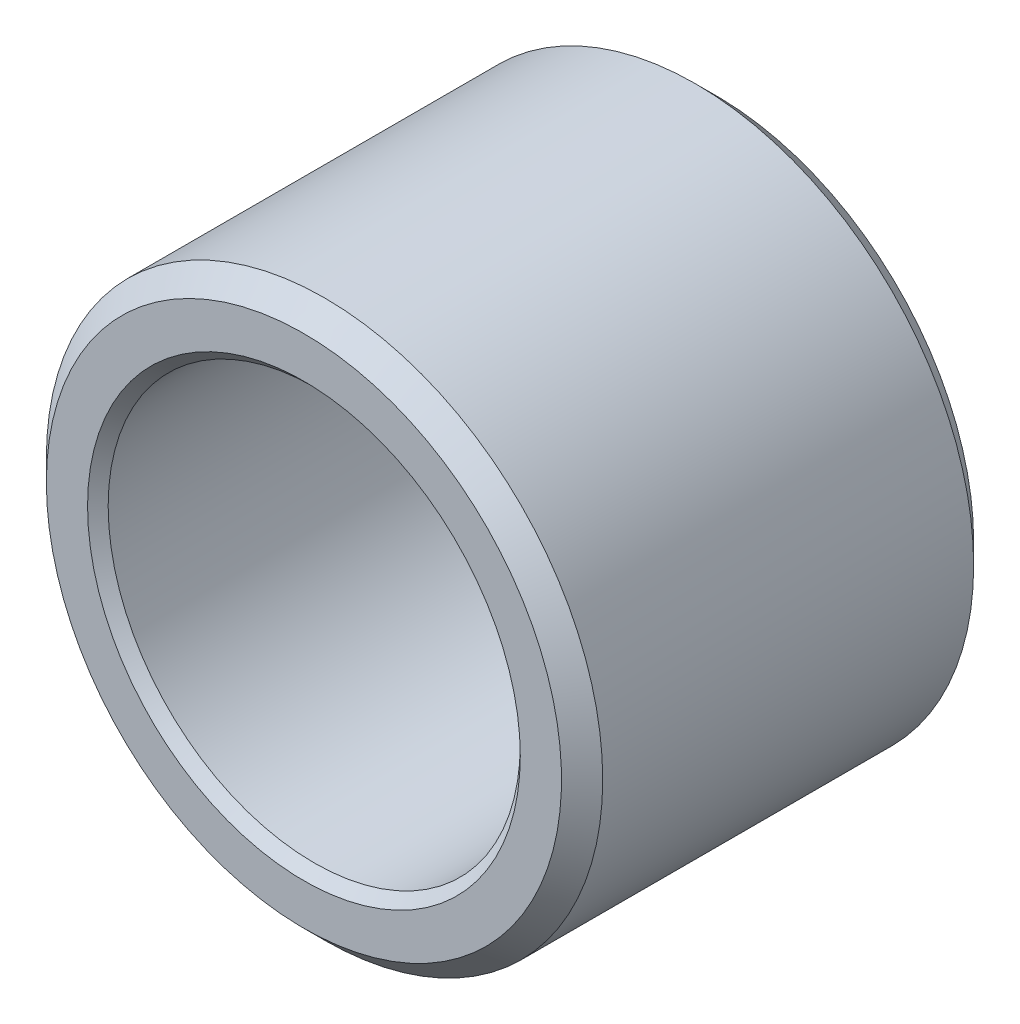
ISO-10303-21;
HEADER;
FILE_DESCRIPTION(('STEP AP214'),'2;1');
FILE_NAME('part.step','',(''),(''),'','','');
FILE_SCHEMA(('AUTOMOTIVE_DESIGN { 1 0 10303 214 1 1 1 1 }'));
ENDSEC;
DATA;
#1=APPLICATION_CONTEXT('core data for automotive mechanical design processes');
#2=APPLICATION_PROTOCOL_DEFINITION('international standard','automotive_design',2000,#1);
#3=PRODUCT_CONTEXT('',#1,'mechanical');
#4=PRODUCT('Part','Part','',(#3));
#5=PRODUCT_RELATED_PRODUCT_CATEGORY('part','',(#4));
#6=PRODUCT_DEFINITION_FORMATION('','',#4);
#7=PRODUCT_DEFINITION_CONTEXT('part definition',#1,'design');
#8=PRODUCT_DEFINITION('design','',#6,#7);
#9=PRODUCT_DEFINITION_SHAPE('','',#8);
#10=(LENGTH_UNIT() NAMED_UNIT(*) SI_UNIT(.MILLI.,.METRE.));
#11=(NAMED_UNIT(*) PLANE_ANGLE_UNIT() SI_UNIT($,.RADIAN.));
#12=(NAMED_UNIT(*) SI_UNIT($,.STERADIAN.) SOLID_ANGLE_UNIT());
#13=UNCERTAINTY_MEASURE_WITH_UNIT(LENGTH_MEASURE(1.E-05),#10,'distance_accuracy_value','');
#14=(GEOMETRIC_REPRESENTATION_CONTEXT(3) GLOBAL_UNCERTAINTY_ASSIGNED_CONTEXT((#13)) GLOBAL_UNIT_ASSIGNED_CONTEXT((#10,
#11,#12)) REPRESENTATION_CONTEXT('',''));
#15=CARTESIAN_POINT('',(0.,0.,0.));
#16=DIRECTION('',(0.,0.,1.));
#17=DIRECTION('',(1.,0.,0.));
#18=AXIS2_PLACEMENT_3D('',#15,#16,#17);
#19=CARTESIAN_POINT('',(0.,-2.77555756156289E-13,20.));
#20=DIRECTION('',(0.,0.,1.));
#21=DIRECTION('',(1.,0.,0.));
#22=AXIS2_PLACEMENT_3D('',#19,#20,#21);
#23=PLANE('',#22);
#24=CARTESIAN_POINT('',(0.,-2.77555756156289E-13,20.));
#25=DIRECTION('',(0.,0.,1.));
#26=DIRECTION('',(1.,0.,0.));
#27=AXIS2_PLACEMENT_3D('',#24,#25,#26);
#28=CIRCLE('',#27,10.5);
#29=CARTESIAN_POINT('',(10.5,-2.77555756156289E-13,20.));
#30=VERTEX_POINT('',#29);
#31=EDGE_CURVE('E12',#30,#30,#28,.F.);
#32=ORIENTED_EDGE('',*,*,#31,.T.);
#33=EDGE_LOOP('',(#32));
#34=FACE_BOUND('',#33,.T.);
#35=CARTESIAN_POINT('',(0.,-2.77555756156289E-13,20.));
#36=DIRECTION('',(0.,0.,1.));
#37=DIRECTION('',(1.,0.,0.));
#38=AXIS2_PLACEMENT_3D('',#35,#36,#37);
#39=CIRCLE('',#38,12.5);
#40=CARTESIAN_POINT('',(-12.5,-2.77555756156289E-13,20.));
#41=VERTEX_POINT('',#40);
#42=EDGE_CURVE('E78',#41,#41,#39,.T.);
#43=ORIENTED_EDGE('',*,*,#42,.T.);
#44=EDGE_LOOP('',(#43));
#45=FACE_BOUND('',#44,.T.);
#46=ADVANCED_FACE('F49',(#34,#45),#23,.T.);
#47=CARTESIAN_POINT('',(0.,0.,0.));
#48=DIRECTION('',(0.,0.,1.));
#49=DIRECTION('',(1.,0.,0.));
#50=AXIS2_PLACEMENT_3D('',#47,#48,#49);
#51=PLANE('',#50);
#52=CARTESIAN_POINT('',(0.,0.,0.));
#53=DIRECTION('',(0.,0.,1.));
#54=DIRECTION('',(1.,0.,0.));
#55=AXIS2_PLACEMENT_3D('',#52,#53,#54);
#56=CIRCLE('',#55,10.5);
#57=CARTESIAN_POINT('',(-10.5,0.,0.));
#58=VERTEX_POINT('',#57);
#59=EDGE_CURVE('E64',#58,#58,#56,.T.);
#60=ORIENTED_EDGE('',*,*,#59,.T.);
#61=EDGE_LOOP('',(#60));
#62=FACE_BOUND('',#61,.T.);
#63=CARTESIAN_POINT('',(0.,0.,0.));
#64=DIRECTION('',(0.,0.,1.));
#65=DIRECTION('',(1.,0.,0.));
#66=AXIS2_PLACEMENT_3D('',#63,#64,#65);
#67=CIRCLE('',#66,12.5);
#68=CARTESIAN_POINT('',(12.5,0.,0.));
#69=VERTEX_POINT('',#68);
#70=EDGE_CURVE('E69',#69,#69,#67,.F.);
#71=ORIENTED_EDGE('',*,*,#70,.T.);
#72=EDGE_LOOP('',(#71));
#73=FACE_BOUND('',#72,.T.);
#74=ADVANCED_FACE('F101',(#62,#73),#51,.F.);
#75=CARTESIAN_POINT('',(0.,-2.77555756156289E-13,20.));
#76=DIRECTION('',(0.,0.,-1.));
#77=DIRECTION('',(-1.,0.,0.));
#78=AXIS2_PLACEMENT_3D('',#75,#76,#77);
#79=CYLINDRICAL_SURFACE('',#78,13.5);
#80=CARTESIAN_POINT('',(1.11022302462516E-13,-1.66533453693773E-13,19.));
#81=DIRECTION('',(0.,0.,1.));
#82=DIRECTION('',(1.,0.,0.));
#83=AXIS2_PLACEMENT_3D('',#80,#81,#82);
#84=CIRCLE('',#83,13.5);
#85=CARTESIAN_POINT('',(-13.5,-2.77583511731905E-13,19.));
#86=VERTEX_POINT('',#85);
#87=EDGE_CURVE('E72',#86,#86,#84,.F.);
#88=CARTESIAN_POINT('',(0.,-1.66533453693773E-13,1.00000000000011));
#89=DIRECTION('',(0.,0.,1.));
#90=DIRECTION('',(1.,0.,0.));
#91=AXIS2_PLACEMENT_3D('',#88,#89,#90);
#92=CIRCLE('',#91,13.5);
#93=CARTESIAN_POINT('',(-13.5,-2.78083112092986E-13,1.00000000000011));
#94=VERTEX_POINT('',#93);
#95=EDGE_CURVE('E75',#94,#94,#92,.T.);
#96=CARTESIAN_POINT('',(-13.5,-2.77583511731905E-13,19.));
#97=CARTESIAN_POINT('',(-13.5,-2.77588715902333E-13,18.8125));
#98=CARTESIAN_POINT('',(-13.5,-2.77593920072761E-13,18.625));
#99=CARTESIAN_POINT('',(-13.5,-2.77604328413616E-13,18.25));
#100=CARTESIAN_POINT('',(-13.5,-2.77609532584044E-13,18.0625));
#101=CARTESIAN_POINT('',(-13.5,-2.776199409249E-13,17.6875));
#102=CARTESIAN_POINT('',(-13.5,-2.77625145095328E-13,17.5));
#103=CARTESIAN_POINT('',(-13.5,-2.77635553436184E-13,17.125));
#104=CARTESIAN_POINT('',(-13.5,-2.77640757606612E-13,16.9375));
#105=CARTESIAN_POINT('',(-13.5,-2.77651165947468E-13,16.5625));
#106=CARTESIAN_POINT('',(-13.5,-2.77656370117896E-13,16.375));
#107=CARTESIAN_POINT('',(-13.5,-2.77666778458752E-13,16.));
#108=CARTESIAN_POINT('',(-13.5,-2.7767198262918E-13,15.8125));
#109=CARTESIAN_POINT('',(-13.5,-2.77682390970035E-13,15.4375));
#110=CARTESIAN_POINT('',(-13.5,-2.77687595140463E-13,15.25));
#111=CARTESIAN_POINT('',(-13.5,-2.77698003481319E-13,14.875));
#112=CARTESIAN_POINT('',(-13.5,-2.77703207651747E-13,14.6875));
#113=CARTESIAN_POINT('',(-13.5,-2.77713615992603E-13,14.3125));
#114=CARTESIAN_POINT('',(-13.5,-2.77718820163031E-13,14.125));
#115=CARTESIAN_POINT('',(-13.5,-2.77729228503887E-13,13.75));
#116=CARTESIAN_POINT('',(-13.5,-2.77734432674315E-13,13.5625));
#117=CARTESIAN_POINT('',(-13.5,-2.77744841015171E-13,13.1875));
#118=CARTESIAN_POINT('',(-13.5,-2.77750045185599E-13,13.));
#119=CARTESIAN_POINT('',(-13.5,-2.77760453526454E-13,12.6250000000001));
#120=CARTESIAN_POINT('',(-13.5,-2.77765657696882E-13,12.4375000000001));
#121=CARTESIAN_POINT('',(-13.5,-2.77776066037738E-13,12.0625000000001));
#122=CARTESIAN_POINT('',(-13.5,-2.77781270208166E-13,11.8750000000001));
#123=CARTESIAN_POINT('',(-13.5,-2.77791678549022E-13,11.5000000000001));
#124=CARTESIAN_POINT('',(-13.5,-2.7779688271945E-13,11.3125000000001));
#125=CARTESIAN_POINT('',(-13.5,-2.77807291060306E-13,10.9375000000001));
#126=CARTESIAN_POINT('',(-13.5,-2.77812495230734E-13,10.7500000000001));
#127=CARTESIAN_POINT('',(-13.5,-2.7782290357159E-13,10.3750000000001));
#128=CARTESIAN_POINT('',(-13.5,-2.77828107742017E-13,10.1875000000001));
#129=CARTESIAN_POINT('',(-13.5,-2.77838516082873E-13,9.81250000000007));
#130=CARTESIAN_POINT('',(-13.5,-2.77843720253301E-13,9.62500000000007));
#131=CARTESIAN_POINT('',(-13.5,-2.77854128594157E-13,9.25000000000007));
#132=CARTESIAN_POINT('',(-13.5,-2.77859332764585E-13,9.06250000000007));
#133=CARTESIAN_POINT('',(-13.5,-2.77869741105441E-13,8.68750000000007));
#134=CARTESIAN_POINT('',(-13.5,-2.77874945275869E-13,8.50000000000007));
#135=CARTESIAN_POINT('',(-13.5,-2.77885353616725E-13,8.12500000000008));
#136=CARTESIAN_POINT('',(-13.5,-2.77890557787153E-13,7.93750000000008));
#137=CARTESIAN_POINT('',(-13.5,-2.77900966128008E-13,7.56250000000008));
#138=CARTESIAN_POINT('',(-13.5,-2.77906170298436E-13,7.37500000000008));
#139=CARTESIAN_POINT('',(-13.5,-2.77916578639292E-13,7.00000000000008));
#140=CARTESIAN_POINT('',(-13.5,-2.7792178280972E-13,6.81250000000008));
#141=CARTESIAN_POINT('',(-13.5,-2.77932191150576E-13,6.43750000000009));
#142=CARTESIAN_POINT('',(-13.5,-2.77937395321004E-13,6.25000000000009));
#143=CARTESIAN_POINT('',(-13.5,-2.7794780366186E-13,5.87500000000009));
#144=CARTESIAN_POINT('',(-13.5,-2.77953007832288E-13,5.68750000000009));
#145=CARTESIAN_POINT('',(-13.5,-2.77963416173144E-13,5.31250000000009));
#146=CARTESIAN_POINT('',(-13.5,-2.77968620343572E-13,5.12500000000009));
#147=CARTESIAN_POINT('',(-13.5,-2.77979028684427E-13,4.75000000000009));
#148=CARTESIAN_POINT('',(-13.5,-2.77984232854855E-13,4.5625000000001));
#149=CARTESIAN_POINT('',(-13.5,-2.77994641195711E-13,4.1875000000001));
#150=CARTESIAN_POINT('',(-13.5,-2.77999845366139E-13,4.0000000000001));
#151=CARTESIAN_POINT('',(-13.5,-2.78010253706995E-13,3.6250000000001));
#152=CARTESIAN_POINT('',(-13.5,-2.78015457877423E-13,3.4375000000001));
#153=CARTESIAN_POINT('',(-13.5,-2.78025866218279E-13,3.0625000000001));
#154=CARTESIAN_POINT('',(-13.5,-2.78031070388707E-13,2.8750000000001));
#155=CARTESIAN_POINT('',(-13.5,-2.78041478729563E-13,2.5000000000001));
#156=CARTESIAN_POINT('',(-13.5,-2.78046682899991E-13,2.3125000000001));
#157=CARTESIAN_POINT('',(-13.5,-2.78057091240846E-13,1.93750000000011));
#158=CARTESIAN_POINT('',(-13.5,-2.78062295411274E-13,1.75000000000011));
#159=CARTESIAN_POINT('',(-13.5,-2.7807270375213E-13,1.37500000000011));
#160=CARTESIAN_POINT('',(-13.5,-2.78077907922558E-13,1.18750000000011));
#161=CARTESIAN_POINT('',(-13.5,-2.78083112092986E-13,1.00000000000011));
#162=B_SPLINE_CURVE_WITH_KNOTS('',3,(#96,#97,#98,#99,#100,#101,#102,#103,#104,#105,#106,#107,
#108,#109,#110,#111,#112,#113,#114,#115,#116,#117,#118,#119,#120,#121,#122,#123,#124,#125,#126,
#127,#128,#129,#130,#131,#132,#133,#134,#135,#136,#137,#138,#139,#140,#141,#142,#143,#144,#145,
#146,#147,#148,#149,#150,#151,#152,#153,#154,#155,#156,#157,#158,#159,#160,#161),.UNSPECIFIED.,
.F.,.F.,(4,2,2,2,2,2,2,2,2,2,2,2,2,2,2,2,2,2,2,2,2,2,2,2,2,2,2,2,2,2,2,2,4),(0.,
0.562499999999997,1.12499999999999,1.68749999999999,2.24999999999999,2.81249999999999,
3.37499999999998,3.93749999999998,4.49999999999998,5.06249999999997,5.62499999999997,
6.18749999999997,6.74999999999996,7.31249999999996,7.87499999999996,8.43749999999996,
8.99999999999995,9.56249999999995,10.1249999999999,10.6874999999999,11.2499999999999,
11.8124999999999,12.3749999999999,12.9374999999999,13.4999999999999,14.0624999999999,
14.6249999999999,15.1874999999999,15.7499999999999,16.3124999999999,16.8749999999999,
17.4374999999999,17.9999999999999),.UNSPECIFIED.);
#163=EDGE_CURVE('BSEAM96',#86,#94,#162,.T.);
#164=ORIENTED_EDGE('',*,*,#87,.T.);
#165=ORIENTED_EDGE('',*,*,#95,.T.);
#166=ORIENTED_EDGE('',*,*,#163,.T.);
#167=ORIENTED_EDGE('',*,*,#163,.F.);
#168=EDGE_LOOP('',(#164,#166,#165,#167));
#169=FACE_BOUND('',#168,.T.);
#170=ADVANCED_FACE('F96',(#169),#79,.T.);
#171=CARTESIAN_POINT('',(0.,-2.77555756156289E-13,20.));
#172=DIRECTION('',(0.,0.,-1.));
#173=DIRECTION('',(-1.,0.,0.));
#174=AXIS2_PLACEMENT_3D('',#171,#172,#173);
#175=CYLINDRICAL_SURFACE('',#174,10.);
#176=CARTESIAN_POINT('',(0.,0.,0.500000000000056));
#177=DIRECTION('',(0.,0.,1.));
#178=DIRECTION('',(1.,0.,0.));
#179=AXIS2_PLACEMENT_3D('',#176,#177,#178);
#180=CIRCLE('',#179,10.);
#181=CARTESIAN_POINT('',(-10.,-2.78096989880794E-13,0.500000000000056));
#182=VERTEX_POINT('',#181);
#183=EDGE_CURVE('E56',#182,#182,#180,.F.);
#184=CARTESIAN_POINT('',(0.,-1.66533453693773E-13,19.5000000000001));
#185=DIRECTION('',(0.,0.,1.));
#186=DIRECTION('',(1.,0.,0.));
#187=AXIS2_PLACEMENT_3D('',#184,#185,#186);
#188=CIRCLE('',#187,10.);
#189=CARTESIAN_POINT('',(-10.,-2.77569633944097E-13,19.5000000000001));
#190=VERTEX_POINT('',#189);
#191=EDGE_CURVE('E60',#190,#190,#188,.T.);
#192=CARTESIAN_POINT('',(-10.,-2.78096989880794E-13,0.500000000000056));
#193=CARTESIAN_POINT('',(-10.,-2.78091496589787E-13,0.697916666666723));
#194=CARTESIAN_POINT('',(-10.,-2.78086003298779E-13,0.89583333333339));
#195=CARTESIAN_POINT('',(-10.,-2.78075016716765E-13,1.29166666666672));
#196=CARTESIAN_POINT('',(-10.,-2.78069523425758E-13,1.48958333333339));
#197=CARTESIAN_POINT('',(-10.,-2.78058536843743E-13,1.88541666666672));
#198=CARTESIAN_POINT('',(-10.,-2.78053043552736E-13,2.08333333333339));
#199=CARTESIAN_POINT('',(-10.,-2.78042056970721E-13,2.47916666666672));
#200=CARTESIAN_POINT('',(-10.,-2.78036563679714E-13,2.67708333333339));
#201=CARTESIAN_POINT('',(-10.,-2.780255770977E-13,3.07291666666673));
#202=CARTESIAN_POINT('',(-10.,-2.78020083806692E-13,3.27083333333339));
#203=CARTESIAN_POINT('',(-10.,-2.78009097224678E-13,3.66666666666673));
#204=CARTESIAN_POINT('',(-10.,-2.7800360393367E-13,3.86458333333339));
#205=CARTESIAN_POINT('',(-10.,-2.77992617351656E-13,4.26041666666673));
#206=CARTESIAN_POINT('',(-10.,-2.77987124060649E-13,4.45833333333339));
#207=CARTESIAN_POINT('',(-10.,-2.77976137478634E-13,4.85416666666673));
#208=CARTESIAN_POINT('',(-10.,-2.77970644187627E-13,5.05208333333339));
#209=CARTESIAN_POINT('',(-10.,-2.77959657605612E-13,5.44791666666673));
#210=CARTESIAN_POINT('',(-10.,-2.77954164314605E-13,5.64583333333339));
#211=CARTESIAN_POINT('',(-10.,-2.77943177732591E-13,6.04166666666673));
#212=CARTESIAN_POINT('',(-10.,-2.77937684441583E-13,6.23958333333339));
#213=CARTESIAN_POINT('',(-10.,-2.77926697859569E-13,6.63541666666673));
#214=CARTESIAN_POINT('',(-10.,-2.77921204568562E-13,6.83333333333339));
#215=CARTESIAN_POINT('',(-10.,-2.77910217986547E-13,7.22916666666673));
#216=CARTESIAN_POINT('',(-10.,-2.7790472469554E-13,7.4270833333334));
#217=CARTESIAN_POINT('',(-10.,-2.77893738113525E-13,7.82291666666673));
#218=CARTESIAN_POINT('',(-10.,-2.77888244822518E-13,8.0208333333334));
#219=CARTESIAN_POINT('',(-10.,-2.77877258240504E-13,8.41666666666673));
#220=CARTESIAN_POINT('',(-10.,-2.77871764949496E-13,8.6145833333334));
#221=CARTESIAN_POINT('',(-10.,-2.77860778367482E-13,9.01041666666673));
#222=CARTESIAN_POINT('',(-10.,-2.77855285076474E-13,9.2083333333334));
#223=CARTESIAN_POINT('',(-10.,-2.7784429849446E-13,9.60416666666673));
#224=CARTESIAN_POINT('',(-10.,-2.77838805203453E-13,9.8020833333334));
#225=CARTESIAN_POINT('',(-10.,-2.77827818621438E-13,10.1979166666667));
#226=CARTESIAN_POINT('',(-10.,-2.77822325330431E-13,10.3958333333334));
#227=CARTESIAN_POINT('',(-10.,-2.77811338748416E-13,10.7916666666667));
#228=CARTESIAN_POINT('',(-10.,-2.77805845457409E-13,10.9895833333334));
#229=CARTESIAN_POINT('',(-10.,-2.77794858875395E-13,11.3854166666667));
#230=CARTESIAN_POINT('',(-10.,-2.77789365584387E-13,11.5833333333334));
#231=CARTESIAN_POINT('',(-10.,-2.77778379002373E-13,11.9791666666667));
#232=CARTESIAN_POINT('',(-10.,-2.77772885711366E-13,12.1770833333334));
#233=CARTESIAN_POINT('',(-10.,-2.77761899129351E-13,12.5729166666667));
#234=CARTESIAN_POINT('',(-10.,-2.77756405838344E-13,12.7708333333334));
#235=CARTESIAN_POINT('',(-10.,-2.77745419256329E-13,13.1666666666667));
#236=CARTESIAN_POINT('',(-10.,-2.77739925965322E-13,13.3645833333334));
#237=CARTESIAN_POINT('',(-10.,-2.77728939383308E-13,13.7604166666667));
#238=CARTESIAN_POINT('',(-10.,-2.777234460923E-13,13.9583333333334));
#239=CARTESIAN_POINT('',(-10.,-2.77712459510286E-13,14.3541666666667));
#240=CARTESIAN_POINT('',(-10.,-2.77706966219278E-13,14.5520833333334));
#241=CARTESIAN_POINT('',(-10.,-2.77695979637264E-13,14.9479166666667));
#242=CARTESIAN_POINT('',(-10.,-2.77690486346257E-13,15.1458333333334));
#243=CARTESIAN_POINT('',(-10.,-2.77679499764242E-13,15.5416666666667));
#244=CARTESIAN_POINT('',(-10.,-2.77674006473235E-13,15.7395833333334));
#245=CARTESIAN_POINT('',(-10.,-2.7766301989122E-13,16.1354166666667));
#246=CARTESIAN_POINT('',(-10.,-2.77657526600213E-13,16.3333333333334));
#247=CARTESIAN_POINT('',(-10.,-2.77646540018199E-13,16.7291666666667));
#248=CARTESIAN_POINT('',(-10.,-2.77641046727191E-13,16.9270833333334));
#249=CARTESIAN_POINT('',(-10.,-2.77630060145177E-13,17.3229166666667));
#250=CARTESIAN_POINT('',(-10.,-2.7762456685417E-13,17.5208333333334));
#251=CARTESIAN_POINT('',(-10.,-2.77613580272155E-13,17.9166666666667));
#252=CARTESIAN_POINT('',(-10.,-2.77608086981148E-13,18.1145833333334));
#253=CARTESIAN_POINT('',(-10.,-2.77597100399133E-13,18.5104166666667));
#254=CARTESIAN_POINT('',(-10.,-2.77591607108126E-13,18.7083333333334));
#255=CARTESIAN_POINT('',(-10.,-2.77580620526111E-13,19.1041666666667));
#256=CARTESIAN_POINT('',(-10.,-2.77575127235104E-13,19.3020833333334));
#257=CARTESIAN_POINT('',(-10.,-2.77569633944097E-13,19.5000000000001));
#258=B_SPLINE_CURVE_WITH_KNOTS('',3,(#192,#193,#194,#195,#196,#197,#198,#199,#200,#201,#202,
#203,#204,#205,#206,#207,#208,#209,#210,#211,#212,#213,#214,#215,#216,#217,#218,#219,#220,#221,
#222,#223,#224,#225,#226,#227,#228,#229,#230,#231,#232,#233,#234,#235,#236,#237,#238,#239,#240,
#241,#242,#243,#244,#245,#246,#247,#248,#249,#250,#251,#252,#253,#254,#255,#256,#257),
.UNSPECIFIED.,.F.,.F.,(4,2,2,2,2,2,2,2,2,2,2,2,2,2,2,2,2,2,2,2,2,2,2,2,2,2,2,2,2,2,2,2,4),(0.,
0.593750000000001,1.1875,1.78125,2.375,2.96875,3.5625,4.15625,4.75,5.34375,5.9375,6.53125,
7.12500000000001,7.71875000000001,8.31250000000001,8.90625000000001,9.50000000000001,10.09375,
10.6875,11.28125,11.875,12.46875,13.0625,13.65625,14.25,14.84375,15.4375,16.03125,16.625,
17.21875,17.8125,18.40625,19.),.UNSPECIFIED.);
#259=EDGE_CURVE('BSEAM86',#182,#190,#258,.T.);
#260=ORIENTED_EDGE('',*,*,#183,.T.);
#261=ORIENTED_EDGE('',*,*,#191,.T.);
#262=ORIENTED_EDGE('',*,*,#259,.T.);
#263=ORIENTED_EDGE('',*,*,#259,.F.);
#264=EDGE_LOOP('',(#260,#262,#261,#263));
#265=FACE_BOUND('',#264,.T.);
#266=ADVANCED_FACE('F86',(#265),#175,.F.);
#267=CARTESIAN_POINT('',(0.,-2.77555756156289E-13,20.));
#268=DIRECTION('',(0.,0.,-1.));
#269=DIRECTION('',(-1.,0.,0.));
#270=AXIS2_PLACEMENT_3D('',#267,#268,#269);
#271=CONICAL_SURFACE('',#270,12.5,0.785398163397448);
#272=CARTESIAN_POINT('',(-13.5,-2.77583511731905E-13,19.));
#273=CARTESIAN_POINT('',(-13.4895833333333,-2.77583222611325E-13,19.0104166666667));
#274=CARTESIAN_POINT('',(-13.4791666666667,-2.77582933490746E-13,19.0208333333333));
#275=CARTESIAN_POINT('',(-13.4583333333333,-2.77582355249587E-13,19.0416666666667));
#276=CARTESIAN_POINT('',(-13.4479166666667,-2.77582066129008E-13,19.0520833333333));
#277=CARTESIAN_POINT('',(-13.4270833333333,-2.77581487887849E-13,19.0729166666667));
#278=CARTESIAN_POINT('',(-13.4166666666667,-2.7758119876727E-13,19.0833333333333));
#279=CARTESIAN_POINT('',(-13.3958333333333,-2.77580620526111E-13,19.1041666666667));
#280=CARTESIAN_POINT('',(-13.3854166666667,-2.77580331405532E-13,19.1145833333333));
#281=CARTESIAN_POINT('',(-13.3645833333333,-2.77579753164373E-13,19.1354166666667));
#282=CARTESIAN_POINT('',(-13.3541666666667,-2.77579464043794E-13,19.1458333333333));
#283=CARTESIAN_POINT('',(-13.3333333333333,-2.77578885802635E-13,19.1666666666667));
#284=CARTESIAN_POINT('',(-13.3229166666667,-2.77578596682056E-13,19.1770833333333));
#285=CARTESIAN_POINT('',(-13.3020833333333,-2.77578018440898E-13,19.1979166666667));
#286=CARTESIAN_POINT('',(-13.2916666666667,-2.77577729320318E-13,19.2083333333333));
#287=CARTESIAN_POINT('',(-13.2708333333333,-2.77577151079159E-13,19.2291666666667));
#288=CARTESIAN_POINT('',(-13.2604166666667,-2.7757686195858E-13,19.2395833333333));
#289=CARTESIAN_POINT('',(-13.2395833333333,-2.77576283717421E-13,19.2604166666667));
#290=CARTESIAN_POINT('',(-13.2291666666667,-2.77575994596842E-13,19.2708333333333));
#291=CARTESIAN_POINT('',(-13.2083333333333,-2.77575416355684E-13,19.2916666666667));
#292=CARTESIAN_POINT('',(-13.1979166666667,-2.77575127235104E-13,19.3020833333333));
#293=CARTESIAN_POINT('',(-13.1770833333333,-2.77574548993946E-13,19.3229166666667));
#294=CARTESIAN_POINT('',(-13.1666666666667,-2.77574259873366E-13,19.3333333333333));
#295=CARTESIAN_POINT('',(-13.1458333333333,-2.77573681632208E-13,19.3541666666667));
#296=CARTESIAN_POINT('',(-13.1354166666667,-2.77573392511628E-13,19.3645833333333));
#297=CARTESIAN_POINT('',(-13.1145833333333,-2.7757281427047E-13,19.3854166666667));
#298=CARTESIAN_POINT('',(-13.1041666666667,-2.7757252514989E-13,19.3958333333333));
#299=CARTESIAN_POINT('',(-13.0833333333333,-2.77571946908732E-13,19.4166666666667));
#300=CARTESIAN_POINT('',(-13.0729166666667,-2.77571657788152E-13,19.4270833333334));
#301=CARTESIAN_POINT('',(-13.0520833333333,-2.77571079546994E-13,19.4479166666667));
#302=CARTESIAN_POINT('',(-13.0416666666667,-2.77570790426414E-13,19.4583333333333));
#303=CARTESIAN_POINT('',(-13.0208333333333,-2.77570212185256E-13,19.4791666666667));
#304=CARTESIAN_POINT('',(-13.0104166666667,-2.77569923064676E-13,19.4895833333333));
#305=CARTESIAN_POINT('',(-12.9895833333333,-2.77569344823518E-13,19.5104166666667));
#306=CARTESIAN_POINT('',(-12.9791666666667,-2.77569055702938E-13,19.5208333333333));
#307=CARTESIAN_POINT('',(-12.9583333333333,-2.7756847746178E-13,19.5416666666667));
#308=CARTESIAN_POINT('',(-12.9479166666667,-2.775681883412E-13,19.5520833333333));
#309=CARTESIAN_POINT('',(-12.9270833333333,-2.77567610100042E-13,19.5729166666667));
#310=CARTESIAN_POINT('',(-12.9166666666667,-2.77567320979462E-13,19.5833333333333));
#311=CARTESIAN_POINT('',(-12.8958333333333,-2.77566742738304E-13,19.6041666666667));
#312=CARTESIAN_POINT('',(-12.8854166666667,-2.77566453617724E-13,19.6145833333333));
#313=CARTESIAN_POINT('',(-12.8645833333333,-2.77565875376566E-13,19.6354166666667));
#314=CARTESIAN_POINT('',(-12.8541666666667,-2.77565586255986E-13,19.6458333333333));
#315=CARTESIAN_POINT('',(-12.8333333333333,-2.77565008014828E-13,19.6666666666667));
#316=CARTESIAN_POINT('',(-12.8229166666667,-2.77564718894248E-13,19.6770833333334));
#317=CARTESIAN_POINT('',(-12.8020833333333,-2.7756414065309E-13,19.6979166666667));
#318=CARTESIAN_POINT('',(-12.7916666666667,-2.7756385153251E-13,19.7083333333333));
#319=CARTESIAN_POINT('',(-12.7708333333333,-2.77563273291352E-13,19.7291666666667));
#320=CARTESIAN_POINT('',(-12.7604166666667,-2.77562984170772E-13,19.7395833333333));
#321=CARTESIAN_POINT('',(-12.7395833333333,-2.77562405929614E-13,19.7604166666667));
#322=CARTESIAN_POINT('',(-12.7291666666667,-2.77562116809034E-13,19.7708333333333));
#323=CARTESIAN_POINT('',(-12.7083333333333,-2.77561538567876E-13,19.7916666666667));
#324=CARTESIAN_POINT('',(-12.6979166666667,-2.77561249447296E-13,19.8020833333333));
#325=CARTESIAN_POINT('',(-12.6770833333333,-2.77560671206138E-13,19.8229166666667));
#326=CARTESIAN_POINT('',(-12.6666666666667,-2.77560382085558E-13,19.8333333333333));
#327=CARTESIAN_POINT('',(-12.6458333333333,-2.775598038444E-13,19.8541666666667));
#328=CARTESIAN_POINT('',(-12.6354166666667,-2.7755951472382E-13,19.8645833333333));
#329=CARTESIAN_POINT('',(-12.6145833333333,-2.77558936482662E-13,19.8854166666667));
#330=CARTESIAN_POINT('',(-12.6041666666667,-2.77558647362082E-13,19.8958333333334));
#331=CARTESIAN_POINT('',(-12.5833333333333,-2.77558069120924E-13,19.9166666666667));
#332=CARTESIAN_POINT('',(-12.5729166666667,-2.77557780000344E-13,19.9270833333334));
#333=CARTESIAN_POINT('',(-12.5520833333333,-2.77557201759186E-13,19.9479166666667));
#334=CARTESIAN_POINT('',(-12.5416666666667,-2.77556912638606E-13,19.9583333333334));
#335=CARTESIAN_POINT('',(-12.5208333333333,-2.77556334397448E-13,19.9791666666667));
#336=CARTESIAN_POINT('',(-12.5104166666667,-2.77556045276868E-13,19.9895833333334));
#337=CARTESIAN_POINT('',(-12.5,-2.77555756156289E-13,20.));
#338=B_SPLINE_CURVE_WITH_KNOTS('',3,(#272,#273,#274,#275,#276,#277,#278,#279,#280,#281,#282,
#283,#284,#285,#286,#287,#288,#289,#290,#291,#292,#293,#294,#295,#296,#297,#298,#299,#300,#301,
#302,#303,#304,#305,#306,#307,#308,#309,#310,#311,#312,#313,#314,#315,#316,#317,#318,#319,#320,
#321,#322,#323,#324,#325,#326,#327,#328,#329,#330,#331,#332,#333,#334,#335,#336,#337),
.UNSPECIFIED.,.F.,.F.,(4,2,2,2,2,2,2,2,2,2,2,2,2,2,2,2,2,2,2,2,2,2,2,2,2,2,2,2,2,2,2,2,4),(0.,
0.0441941738241568,0.0883883476483185,0.132582521472475,0.176776695296637,0.220970869120794,
0.265165042944956,0.309359216769112,0.353553390593274,0.397747564417431,0.441941738241593,
0.486135912065752,0.530330085889911,0.574524259714068,0.61871843353823,0.662912607362386,
0.707106781186548,0.751300955010705,0.795495128834867,0.839689302659023,0.883883476483183,
0.928077650307344,0.972271824131503,1.01646599795566,1.06066017177982,1.10485434560398,
1.14904851942814,1.1932426932523,1.23743686707646,1.28163104090062,1.32582521472478,
1.37001938854894,1.4142135623731),.UNSPECIFIED.);
#339=EDGE_CURVE('BSEAM83',#86,#41,#338,.T.);
#340=ORIENTED_EDGE('',*,*,#87,.F.);
#341=ORIENTED_EDGE('',*,*,#42,.F.);
#342=ORIENTED_EDGE('',*,*,#339,.T.);
#343=ORIENTED_EDGE('',*,*,#339,.F.);
#344=EDGE_LOOP('',(#340,#342,#341,#343));
#345=FACE_BOUND('',#344,.T.);
#346=ADVANCED_FACE('F83',(#345),#271,.T.);
#347=CARTESIAN_POINT('',(0.,-1.66533453693773E-13,1.00000000000011));
#348=DIRECTION('',(0.,0.,1.));
#349=DIRECTION('',(1.,0.,0.));
#350=AXIS2_PLACEMENT_3D('',#347,#348,#349);
#351=CONICAL_SURFACE('',#350,13.5,0.785398163397448);
#352=ORIENTED_EDGE('',*,*,#70,.F.);
#353=EDGE_LOOP('',(#352));
#354=FACE_BOUND('',#353,.T.);
#355=ORIENTED_EDGE('',*,*,#95,.F.);
#356=EDGE_LOOP('',(#355));
#357=FACE_BOUND('',#356,.T.);
#358=ADVANCED_FACE('F85',(#354,#357),#351,.T.);
#359=CARTESIAN_POINT('',(0.,0.,0.));
#360=DIRECTION('',(0.,0.,-1.));
#361=DIRECTION('',(-1.,0.,0.));
#362=AXIS2_PLACEMENT_3D('',#359,#360,#361);
#363=CONICAL_SURFACE('',#362,10.5,0.785398163397443);
#364=CARTESIAN_POINT('',(-9.99999999999995,0.,0.500000000000055));
#365=CARTESIAN_POINT('',(-10.0052083333333,0.,0.494791666666721));
#366=CARTESIAN_POINT('',(-10.0104166666666,0.,0.489583333333387));
#367=CARTESIAN_POINT('',(-10.0208333333333,0.,0.479166666666719));
#368=CARTESIAN_POINT('',(-10.0260416666666,0.,0.473958333333385));
#369=CARTESIAN_POINT('',(-10.0364583333333,0.,0.463541666666717));
#370=CARTESIAN_POINT('',(-10.0416666666666,0.,0.458333333333383));
#371=CARTESIAN_POINT('',(-10.0520833333333,0.,0.447916666666716));
#372=CARTESIAN_POINT('',(-10.0572916666666,0.,0.442708333333382));
#373=CARTESIAN_POINT('',(-10.0677083333333,0.,0.432291666666714));
#374=CARTESIAN_POINT('',(-10.0729166666666,0.,0.42708333333338));
#375=CARTESIAN_POINT('',(-10.0833333333333,0.,0.416666666666712));
#376=CARTESIAN_POINT('',(-10.0885416666666,0.,0.411458333333378));
#377=CARTESIAN_POINT('',(-10.0989583333333,0.,0.40104166666671));
#378=CARTESIAN_POINT('',(-10.1041666666666,0.,0.395833333333377));
#379=CARTESIAN_POINT('',(-10.1145833333333,0.,0.385416666666709));
#380=CARTESIAN_POINT('',(-10.1197916666666,0.,0.380208333333375));
#381=CARTESIAN_POINT('',(-10.1302083333333,0.,0.369791666666707));
#382=CARTESIAN_POINT('',(-10.1354166666666,0.,0.364583333333373));
#383=CARTESIAN_POINT('',(-10.1458333333333,0.,0.354166666666705));
#384=CARTESIAN_POINT('',(-10.1510416666666,0.,0.348958333333371));
#385=CARTESIAN_POINT('',(-10.1614583333333,0.,0.338541666666703));
#386=CARTESIAN_POINT('',(-10.1666666666666,0.,0.333333333333369));
#387=CARTESIAN_POINT('',(-10.1770833333333,0.,0.322916666666702));
#388=CARTESIAN_POINT('',(-10.1822916666666,0.,0.317708333333368));
#389=CARTESIAN_POINT('',(-10.1927083333333,0.,0.3072916666667));
#390=CARTESIAN_POINT('',(-10.1979166666666,0.,0.302083333333366));
#391=CARTESIAN_POINT('',(-10.2083333333333,0.,0.291666666666698));
#392=CARTESIAN_POINT('',(-10.2135416666666,0.,0.286458333333364));
#393=CARTESIAN_POINT('',(-10.2239583333333,0.,0.276041666666696));
#394=CARTESIAN_POINT('',(-10.2291666666666,0.,0.270833333333362));
#395=CARTESIAN_POINT('',(-10.2395833333333,0.,0.260416666666695));
#396=CARTESIAN_POINT('',(-10.2447916666666,0.,0.255208333333361));
#397=CARTESIAN_POINT('',(-10.2552083333333,0.,0.244791666666693));
#398=CARTESIAN_POINT('',(-10.2604166666666,0.,0.239583333333359));
#399=CARTESIAN_POINT('',(-10.2708333333333,0.,0.229166666666691));
#400=CARTESIAN_POINT('',(-10.2760416666666,0.,0.223958333333357));
#401=CARTESIAN_POINT('',(-10.2864583333333,0.,0.213541666666689));
#402=CARTESIAN_POINT('',(-10.2916666666666,0.,0.208333333333355));
#403=CARTESIAN_POINT('',(-10.3020833333333,0.,0.197916666666687));
#404=CARTESIAN_POINT('',(-10.3072916666666,0.,0.192708333333354));
#405=CARTESIAN_POINT('',(-10.3177083333333,0.,0.182291666666686));
#406=CARTESIAN_POINT('',(-10.3229166666666,0.,0.177083333333352));
#407=CARTESIAN_POINT('',(-10.3333333333333,0.,0.166666666666684));
#408=CARTESIAN_POINT('',(-10.3385416666667,0.,0.16145833333335));
#409=CARTESIAN_POINT('',(-10.3489583333333,0.,0.151041666666682));
#410=CARTESIAN_POINT('',(-10.3541666666667,0.,0.145833333333348));
#411=CARTESIAN_POINT('',(-10.3645833333333,0.,0.13541666666668));
#412=CARTESIAN_POINT('',(-10.3697916666667,0.,0.130208333333347));
#413=CARTESIAN_POINT('',(-10.3802083333333,0.,0.119791666666679));
#414=CARTESIAN_POINT('',(-10.3854166666667,0.,0.114583333333345));
#415=CARTESIAN_POINT('',(-10.3958333333333,0.,0.104166666666677));
#416=CARTESIAN_POINT('',(-10.4010416666667,0.,0.0989583333333431));
#417=CARTESIAN_POINT('',(-10.4114583333333,0.,0.0885416666666753));
#418=CARTESIAN_POINT('',(-10.4166666666667,0.,0.0833333333333413));
#419=CARTESIAN_POINT('',(-10.4270833333333,0.,0.0729166666666735));
#420=CARTESIAN_POINT('',(-10.4322916666667,0.,0.0677083333333396));
#421=CARTESIAN_POINT('',(-10.4427083333333,0.,0.0572916666666717));
#422=CARTESIAN_POINT('',(-10.4479166666667,0.,0.0520833333333378));
#423=CARTESIAN_POINT('',(-10.4583333333333,0.,0.04166666666667));
#424=CARTESIAN_POINT('',(-10.4635416666667,0.,0.0364583333333362));
#425=CARTESIAN_POINT('',(-10.4739583333333,0.,0.0260416666666683));
#426=CARTESIAN_POINT('',(-10.4791666666667,0.,0.0208333333333343));
#427=CARTESIAN_POINT('',(-10.4895833333333,0.,0.0104166666666662));
#428=CARTESIAN_POINT('',(-10.4947916666667,0.,0.00520833333333213));
#429=CARTESIAN_POINT('',(-10.5,0.,0.));
#430=B_SPLINE_CURVE_WITH_KNOTS('',3,(#364,#365,#366,#367,#368,#369,#370,#371,#372,#373,#374,
#375,#376,#377,#378,#379,#380,#381,#382,#383,#384,#385,#386,#387,#388,#389,#390,#391,#392,#393,
#394,#395,#396,#397,#398,#399,#400,#401,#402,#403,#404,#405,#406,#407,#408,#409,#410,#411,#412,
#413,#414,#415,#416,#417,#418,#419,#420,#421,#422,#423,#424,#425,#426,#427,#428,#429),
.UNSPECIFIED.,.F.,.F.,(4,2,2,2,2,2,2,2,2,2,2,2,2,2,2,2,2,2,2,2,2,2,2,2,2,2,2,2,2,2,2,2,4),(0.,
0.0220970869120821,0.0441941738241642,0.0662912607362463,0.0883883476483284,0.11048543456041,
0.132582521472493,0.154679608384575,0.176776695296655,0.198873782208738,0.22097086912082,
0.243067956032902,0.265165042944984,0.287262129857066,0.309359216769148,0.33145630368123,
0.353553390593312,0.375650477505394,0.397747564417476,0.419844651329557,0.441941738241639,
0.464038825153721,0.486135912065803,0.508232998977886,0.530330085889968,0.55242717280205,
0.574524259714132,0.596621346626214,0.618718433538296,0.640815520450378,0.66291260736246,
0.685009694274541,0.707106781186623),.UNSPECIFIED.);
#431=EDGE_CURVE('BSEAM93',#182,#58,#430,.T.);
#432=ORIENTED_EDGE('',*,*,#183,.F.);
#433=ORIENTED_EDGE('',*,*,#59,.F.);
#434=ORIENTED_EDGE('',*,*,#431,.T.);
#435=ORIENTED_EDGE('',*,*,#431,.F.);
#436=EDGE_LOOP('',(#432,#434,#433,#435));
#437=FACE_BOUND('',#436,.T.);
#438=ADVANCED_FACE('F93',(#437),#363,.F.);
#439=CARTESIAN_POINT('',(0.,-1.66533453693773E-13,19.5000000000001));
#440=DIRECTION('',(0.,0.,1.));
#441=DIRECTION('',(1.,0.,0.));
#442=AXIS2_PLACEMENT_3D('',#439,#440,#441);
#443=CONICAL_SURFACE('',#442,10.,0.78539816339745);
#444=ORIENTED_EDGE('',*,*,#31,.F.);
#445=EDGE_LOOP('',(#444));
#446=FACE_BOUND('',#445,.T.);
#447=ORIENTED_EDGE('',*,*,#191,.F.);
#448=EDGE_LOOP('',(#447));
#449=FACE_BOUND('',#448,.T.);
#450=ADVANCED_FACE('F51',(#446,#449),#443,.F.);
#451=CLOSED_SHELL('',(#46,#74,#170,#266,#346,#358,#438,#450));
#452=MANIFOLD_SOLID_BREP('B2',#451);
#453=ADVANCED_BREP_SHAPE_REPRESENTATION('',(#18,#452),#14);
#454=SHAPE_DEFINITION_REPRESENTATION(#9,#453);
ENDSEC;
END-ISO-10303-21;
